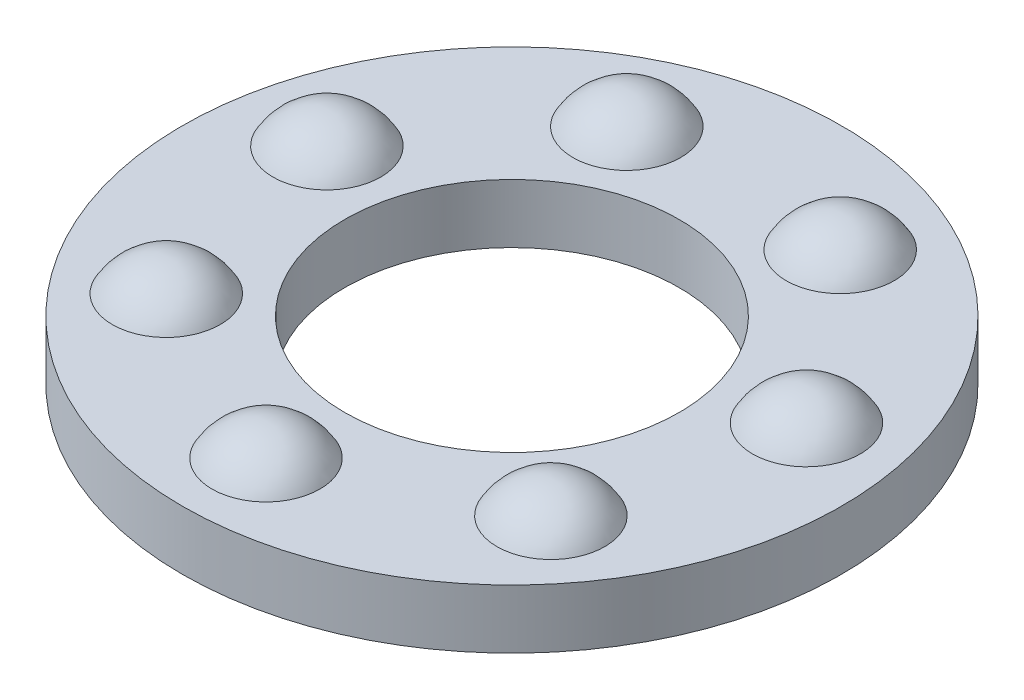
ISO-10303-21;
HEADER;
FILE_DESCRIPTION(('STEP AP214'),'2;1');
FILE_NAME('part.step','',(''),(''),'','','');
FILE_SCHEMA(('AUTOMOTIVE_DESIGN { 1 0 10303 214 1 1 1 1 }'));
ENDSEC;
DATA;
#1=APPLICATION_CONTEXT('core data for automotive mechanical design processes');
#2=APPLICATION_PROTOCOL_DEFINITION('international standard','automotive_design',2000,#1);
#3=PRODUCT_CONTEXT('',#1,'mechanical');
#4=PRODUCT('Part','Part','',(#3));
#5=PRODUCT_RELATED_PRODUCT_CATEGORY('part','',(#4));
#6=PRODUCT_DEFINITION_FORMATION('','',#4);
#7=PRODUCT_DEFINITION_CONTEXT('part definition',#1,'design');
#8=PRODUCT_DEFINITION('design','',#6,#7);
#9=PRODUCT_DEFINITION_SHAPE('','',#8);
#10=(LENGTH_UNIT() NAMED_UNIT(*) SI_UNIT(.MILLI.,.METRE.));
#11=(NAMED_UNIT(*) PLANE_ANGLE_UNIT() SI_UNIT($,.RADIAN.));
#12=(NAMED_UNIT(*) SI_UNIT($,.STERADIAN.) SOLID_ANGLE_UNIT());
#13=UNCERTAINTY_MEASURE_WITH_UNIT(LENGTH_MEASURE(1.E-05),#10,'distance_accuracy_value','');
#14=(GEOMETRIC_REPRESENTATION_CONTEXT(3) GLOBAL_UNCERTAINTY_ASSIGNED_CONTEXT((#13)) GLOBAL_UNIT_ASSIGNED_CONTEXT((#10,
#11,#12)) REPRESENTATION_CONTEXT('',''));
#15=CARTESIAN_POINT('',(0.,0.,0.));
#16=DIRECTION('',(0.,0.,1.));
#17=DIRECTION('',(1.,0.,0.));
#18=AXIS2_PLACEMENT_3D('',#15,#16,#17);
#19=CARTESIAN_POINT('',(0.,0.,2.5));
#20=DIRECTION('',(0.,1.,0.));
#21=DIRECTION('',(0.,0.,-1.));
#22=AXIS2_PLACEMENT_3D('',#19,#20,#21);
#23=SPHERICAL_SURFACE('',#22,0.625000000000001);
#24=CARTESIAN_POINT('',(0.,0.3,2.5));
#25=DIRECTION('',(0.,1.,0.));
#26=DIRECTION('',(0.,0.,1.));
#27=AXIS2_PLACEMENT_3D('',#24,#25,#26);
#28=CIRCLE('',#27,0.548292804986533);
#29=CARTESIAN_POINT('',(0.,0.3,3.04829280498653));
#30=VERTEX_POINT('',#29);
#31=EDGE_CURVE('E72',#30,#30,#28,.F.);
#32=ORIENTED_EDGE('',*,*,#31,.F.);
#33=EDGE_LOOP('',(#32));
#34=FACE_BOUND('',#33,.T.);
#35=ADVANCED_FACE('F39',(#34),#23,.T.);
#36=CARTESIAN_POINT('',(0.,0.3,0.));
#37=DIRECTION('',(0.,1.,0.));
#38=DIRECTION('',(0.,0.,1.));
#39=AXIS2_PLACEMENT_3D('',#36,#37,#38);
#40=PLANE('',#39);
#41=CARTESIAN_POINT('',(1.95457870617006,0.3,1.55872450464686));
#42=DIRECTION('',(0.,1.,0.));
#43=DIRECTION('',(0.,0.,1.));
#44=AXIS2_PLACEMENT_3D('',#41,#42,#43);
#45=CIRCLE('',#44,0.548292804986533);
#46=CARTESIAN_POINT('',(1.95457870617006,0.3,2.10701730963339));
#47=VERTEX_POINT('',#46);
#48=EDGE_CURVE('E10',#47,#47,#45,.T.);
#49=ORIENTED_EDGE('',*,*,#48,.F.);
#50=EDGE_LOOP('',(#49));
#51=FACE_BOUND('',#50,.T.);
#52=CARTESIAN_POINT('',(2.43731978045456,0.3,-0.556302334890763));
#53=DIRECTION('',(0.,1.,0.));
#54=DIRECTION('',(0.,0.,1.));
#55=AXIS2_PLACEMENT_3D('',#52,#53,#54);
#56=CIRCLE('',#55,0.548292804986533);
#57=CARTESIAN_POINT('',(2.43731978045456,0.3,-0.00800952990422923));
#58=VERTEX_POINT('',#57);
#59=EDGE_CURVE('E47',#58,#58,#56,.T.);
#60=ORIENTED_EDGE('',*,*,#59,.F.);
#61=EDGE_LOOP('',(#60));
#62=FACE_BOUND('',#61,.T.);
#63=CARTESIAN_POINT('',(1.08470934779391,0.3,-2.25242216975604));
#64=DIRECTION('',(0.,1.,0.));
#65=DIRECTION('',(0.,0.,1.));
#66=AXIS2_PLACEMENT_3D('',#63,#64,#65);
#67=CIRCLE('',#66,0.548292804986533);
#68=CARTESIAN_POINT('',(1.08470934779391,0.3,-1.70412936476951));
#69=VERTEX_POINT('',#68);
#70=EDGE_CURVE('E54',#69,#69,#67,.T.);
#71=ORIENTED_EDGE('',*,*,#70,.F.);
#72=EDGE_LOOP('',(#71));
#73=FACE_BOUND('',#72,.T.);
#74=CARTESIAN_POINT('',(-1.08470934779388,0.3,-2.25242216975605));
#75=DIRECTION('',(0.,1.,0.));
#76=DIRECTION('',(0.,0.,1.));
#77=AXIS2_PLACEMENT_3D('',#74,#75,#76);
#78=CIRCLE('',#77,0.548292804986533);
#79=CARTESIAN_POINT('',(-1.08470934779388,0.3,-1.70412936476952));
#80=VERTEX_POINT('',#79);
#81=EDGE_CURVE('E60',#80,#80,#78,.T.);
#82=ORIENTED_EDGE('',*,*,#81,.F.);
#83=EDGE_LOOP('',(#82));
#84=FACE_BOUND('',#83,.T.);
#85=CARTESIAN_POINT('',(-2.43731978045456,0.3,-0.556302334890796));
#86=DIRECTION('',(0.,1.,0.));
#87=DIRECTION('',(0.,0.,1.));
#88=AXIS2_PLACEMENT_3D('',#85,#86,#87);
#89=CIRCLE('',#88,0.548292804986533);
#90=CARTESIAN_POINT('',(-2.43731978045456,0.3,-0.00800952990426219));
#91=VERTEX_POINT('',#90);
#92=EDGE_CURVE('E64',#91,#91,#89,.T.);
#93=ORIENTED_EDGE('',*,*,#92,.F.);
#94=EDGE_LOOP('',(#93));
#95=FACE_BOUND('',#94,.T.);
#96=CARTESIAN_POINT('',(-1.95457870617008,0.3,1.55872450464683));
#97=DIRECTION('',(0.,1.,0.));
#98=DIRECTION('',(0.,0.,1.));
#99=AXIS2_PLACEMENT_3D('',#96,#97,#98);
#100=CIRCLE('',#99,0.548292804986533);
#101=CARTESIAN_POINT('',(-1.95457870617008,0.3,2.10701730963336));
#102=VERTEX_POINT('',#101);
#103=EDGE_CURVE('E68',#102,#102,#100,.T.);
#104=ORIENTED_EDGE('',*,*,#103,.F.);
#105=EDGE_LOOP('',(#104));
#106=FACE_BOUND('',#105,.T.);
#107=ORIENTED_EDGE('',*,*,#31,.T.);
#108=EDGE_LOOP('',(#107));
#109=FACE_BOUND('',#108,.T.);
#110=CARTESIAN_POINT('',(0.,0.3,0.));
#111=DIRECTION('',(0.,1.,0.));
#112=DIRECTION('',(0.,0.,1.));
#113=AXIS2_PLACEMENT_3D('',#110,#111,#112);
#114=CIRCLE('',#113,3.35);
#115=CARTESIAN_POINT('',(0.,0.3,3.35));
#116=VERTEX_POINT('',#115);
#117=EDGE_CURVE('E83',#116,#116,#114,.T.);
#118=ORIENTED_EDGE('',*,*,#117,.T.);
#119=EDGE_LOOP('',(#118));
#120=FACE_BOUND('',#119,.T.);
#121=CARTESIAN_POINT('',(0.,0.3,0.));
#122=DIRECTION('',(0.,1.,0.));
#123=DIRECTION('',(0.,0.,1.));
#124=AXIS2_PLACEMENT_3D('',#121,#122,#123);
#125=CIRCLE('',#124,1.7);
#126=CARTESIAN_POINT('',(0.,0.3,1.7));
#127=VERTEX_POINT('',#126);
#128=EDGE_CURVE('E73',#127,#127,#125,.T.);
#129=ORIENTED_EDGE('',*,*,#128,.F.);
#130=EDGE_LOOP('',(#129));
#131=FACE_BOUND('',#130,.T.);
#132=ADVANCED_FACE('F134',(#51,#62,#73,#84,#95,#106,#109,#120,#131),#40,.T.);
#133=CARTESIAN_POINT('',(0.,-0.3,0.));
#134=DIRECTION('',(0.,1.,0.));
#135=DIRECTION('',(0.,0.,1.));
#136=AXIS2_PLACEMENT_3D('',#133,#134,#135);
#137=PLANE('',#136);
#138=CARTESIAN_POINT('',(1.95457870617006,-0.3,1.55872450464686));
#139=DIRECTION('',(0.,1.,0.));
#140=DIRECTION('',(0.,0.,1.));
#141=AXIS2_PLACEMENT_3D('',#138,#139,#140);
#142=CIRCLE('',#141,0.548292804986533);
#143=CARTESIAN_POINT('',(1.95457870617006,-0.3,2.10701730963339));
#144=VERTEX_POINT('',#143);
#145=EDGE_CURVE('E42',#144,#144,#142,.T.);
#146=ORIENTED_EDGE('',*,*,#145,.T.);
#147=EDGE_LOOP('',(#146));
#148=FACE_BOUND('',#147,.T.);
#149=CARTESIAN_POINT('',(2.43731978045456,-0.3,-0.556302334890763));
#150=DIRECTION('',(0.,1.,0.));
#151=DIRECTION('',(0.,0.,1.));
#152=AXIS2_PLACEMENT_3D('',#149,#150,#151);
#153=CIRCLE('',#152,0.548292804986533);
#154=CARTESIAN_POINT('',(2.43731978045456,-0.3,-0.00800952990422923));
#155=VERTEX_POINT('',#154);
#156=EDGE_CURVE('E111',#155,#155,#153,.T.);
#157=ORIENTED_EDGE('',*,*,#156,.T.);
#158=EDGE_LOOP('',(#157));
#159=FACE_BOUND('',#158,.T.);
#160=CARTESIAN_POINT('',(1.08470934779391,-0.3,-2.25242216975604));
#161=DIRECTION('',(0.,1.,0.));
#162=DIRECTION('',(0.,0.,1.));
#163=AXIS2_PLACEMENT_3D('',#160,#161,#162);
#164=CIRCLE('',#163,0.548292804986533);
#165=CARTESIAN_POINT('',(1.08470934779391,-0.3,-1.70412936476951));
#166=VERTEX_POINT('',#165);
#167=EDGE_CURVE('E108',#166,#166,#164,.T.);
#168=ORIENTED_EDGE('',*,*,#167,.T.);
#169=EDGE_LOOP('',(#168));
#170=FACE_BOUND('',#169,.T.);
#171=CARTESIAN_POINT('',(-1.08470934779388,-0.3,-2.25242216975605));
#172=DIRECTION('',(0.,1.,0.));
#173=DIRECTION('',(0.,0.,1.));
#174=AXIS2_PLACEMENT_3D('',#171,#172,#173);
#175=CIRCLE('',#174,0.548292804986533);
#176=CARTESIAN_POINT('',(-1.08470934779388,-0.3,-1.70412936476952));
#177=VERTEX_POINT('',#176);
#178=EDGE_CURVE('E104',#177,#177,#175,.T.);
#179=ORIENTED_EDGE('',*,*,#178,.T.);
#180=EDGE_LOOP('',(#179));
#181=FACE_BOUND('',#180,.T.);
#182=CARTESIAN_POINT('',(-2.43731978045456,-0.3,-0.556302334890796));
#183=DIRECTION('',(0.,1.,0.));
#184=DIRECTION('',(0.,0.,1.));
#185=AXIS2_PLACEMENT_3D('',#182,#183,#184);
#186=CIRCLE('',#185,0.548292804986533);
#187=CARTESIAN_POINT('',(-2.43731978045456,-0.3,-0.00800952990426219));
#188=VERTEX_POINT('',#187);
#189=EDGE_CURVE('E100',#188,#188,#186,.T.);
#190=ORIENTED_EDGE('',*,*,#189,.T.);
#191=EDGE_LOOP('',(#190));
#192=FACE_BOUND('',#191,.T.);
#193=CARTESIAN_POINT('',(-1.95457870617008,-0.3,1.55872450464683));
#194=DIRECTION('',(0.,1.,0.));
#195=DIRECTION('',(0.,0.,1.));
#196=AXIS2_PLACEMENT_3D('',#193,#194,#195);
#197=CIRCLE('',#196,0.548292804986533);
#198=CARTESIAN_POINT('',(-1.95457870617008,-0.3,2.10701730963336));
#199=VERTEX_POINT('',#198);
#200=EDGE_CURVE('E82',#199,#199,#197,.T.);
#201=ORIENTED_EDGE('',*,*,#200,.T.);
#202=EDGE_LOOP('',(#201));
#203=FACE_BOUND('',#202,.T.);
#204=CARTESIAN_POINT('',(0.,-0.3,2.5));
#205=DIRECTION('',(0.,1.,0.));
#206=DIRECTION('',(0.,0.,1.));
#207=AXIS2_PLACEMENT_3D('',#204,#205,#206);
#208=CIRCLE('',#207,0.548292804986533);
#209=CARTESIAN_POINT('',(0.,-0.3,3.04829280498653));
#210=VERTEX_POINT('',#209);
#211=EDGE_CURVE('E87',#210,#210,#208,.F.);
#212=ORIENTED_EDGE('',*,*,#211,.F.);
#213=EDGE_LOOP('',(#212));
#214=FACE_BOUND('',#213,.T.);
#215=CARTESIAN_POINT('',(0.,-0.3,0.));
#216=DIRECTION('',(0.,1.,0.));
#217=DIRECTION('',(0.,0.,1.));
#218=AXIS2_PLACEMENT_3D('',#215,#216,#217);
#219=CIRCLE('',#218,3.35);
#220=CARTESIAN_POINT('',(0.,-0.3,3.35));
#221=VERTEX_POINT('',#220);
#222=EDGE_CURVE('E77',#221,#221,#219,.T.);
#223=ORIENTED_EDGE('',*,*,#222,.F.);
#224=EDGE_LOOP('',(#223));
#225=FACE_BOUND('',#224,.T.);
#226=CARTESIAN_POINT('',(0.,-0.3,0.));
#227=DIRECTION('',(0.,1.,0.));
#228=DIRECTION('',(0.,0.,1.));
#229=AXIS2_PLACEMENT_3D('',#226,#227,#228);
#230=CIRCLE('',#229,1.7);
#231=CARTESIAN_POINT('',(0.,-0.3,1.7));
#232=VERTEX_POINT('',#231);
#233=EDGE_CURVE('E78',#232,#232,#230,.T.);
#234=ORIENTED_EDGE('',*,*,#233,.T.);
#235=EDGE_LOOP('',(#234));
#236=FACE_BOUND('',#235,.T.);
#237=ADVANCED_FACE('F119',(#148,#159,#170,#181,#192,#203,#214,#225,#236),#137,.F.);
#238=CARTESIAN_POINT('',(0.,0.3,0.));
#239=DIRECTION('',(0.,-1.,0.));
#240=DIRECTION('',(0.,0.,-1.));
#241=AXIS2_PLACEMENT_3D('',#238,#239,#240);
#242=CYLINDRICAL_SURFACE('',#241,3.35);
#243=ORIENTED_EDGE('',*,*,#117,.F.);
#244=EDGE_LOOP('',(#243));
#245=FACE_BOUND('',#244,.T.);
#246=ORIENTED_EDGE('',*,*,#222,.T.);
#247=EDGE_LOOP('',(#246));
#248=FACE_BOUND('',#247,.T.);
#249=ADVANCED_FACE('F154',(#245,#248),#242,.T.);
#250=CARTESIAN_POINT('',(0.,0.3,0.));
#251=DIRECTION('',(0.,-1.,0.));
#252=DIRECTION('',(0.,0.,-1.));
#253=AXIS2_PLACEMENT_3D('',#250,#251,#252);
#254=CYLINDRICAL_SURFACE('',#253,1.7);
#255=ORIENTED_EDGE('',*,*,#128,.T.);
#256=EDGE_LOOP('',(#255));
#257=FACE_BOUND('',#256,.T.);
#258=ORIENTED_EDGE('',*,*,#233,.F.);
#259=EDGE_LOOP('',(#258));
#260=FACE_BOUND('',#259,.T.);
#261=ADVANCED_FACE('F145',(#257,#260),#254,.F.);
#262=ORIENTED_EDGE('',*,*,#211,.T.);
#263=EDGE_LOOP('',(#262));
#264=FACE_BOUND('',#263,.T.);
#265=ADVANCED_FACE('F136',(#264),#23,.T.);
#266=CARTESIAN_POINT('',(-1.95457870617008,0.,1.55872450464683));
#267=DIRECTION('',(0.,1.,0.));
#268=DIRECTION('',(0.781831482468031,0.,-0.623489801858732));
#269=AXIS2_PLACEMENT_3D('',#266,#267,#268);
#270=SPHERICAL_SURFACE('',#269,0.625000000000001);
#271=ORIENTED_EDGE('',*,*,#200,.F.);
#272=EDGE_LOOP('',(#271));
#273=FACE_BOUND('',#272,.T.);
#274=ADVANCED_FACE('F144',(#273),#270,.T.);
#275=ORIENTED_EDGE('',*,*,#103,.T.);
#276=EDGE_LOOP('',(#275));
#277=FACE_BOUND('',#276,.T.);
#278=ADVANCED_FACE('F151',(#277),#270,.T.);
#279=CARTESIAN_POINT('',(-2.43731978045456,0.,-0.556302334890796));
#280=DIRECTION('',(0.,1.,0.));
#281=DIRECTION('',(0.974927912181823,0.,0.222520933956318));
#282=AXIS2_PLACEMENT_3D('',#279,#280,#281);
#283=SPHERICAL_SURFACE('',#282,0.625000000000001);
#284=ORIENTED_EDGE('',*,*,#189,.F.);
#285=EDGE_LOOP('',(#284));
#286=FACE_BOUND('',#285,.T.);
#287=ADVANCED_FACE('F174',(#286),#283,.T.);
#288=ORIENTED_EDGE('',*,*,#92,.T.);
#289=EDGE_LOOP('',(#288));
#290=FACE_BOUND('',#289,.T.);
#291=ADVANCED_FACE('F176',(#290),#283,.T.);
#292=CARTESIAN_POINT('',(-1.08470934779388,0.,-2.25242216975605));
#293=DIRECTION('',(0.,1.,0.));
#294=DIRECTION('',(0.433883739117553,0.,0.900968867902422));
#295=AXIS2_PLACEMENT_3D('',#292,#293,#294);
#296=SPHERICAL_SURFACE('',#295,0.625000000000001);
#297=ORIENTED_EDGE('',*,*,#178,.F.);
#298=EDGE_LOOP('',(#297));
#299=FACE_BOUND('',#298,.T.);
#300=ADVANCED_FACE('F179',(#299),#296,.T.);
#301=ORIENTED_EDGE('',*,*,#81,.T.);
#302=EDGE_LOOP('',(#301));
#303=FACE_BOUND('',#302,.T.);
#304=ADVANCED_FACE('F181',(#303),#296,.T.);
#305=CARTESIAN_POINT('',(1.08470934779391,0.,-2.25242216975604));
#306=DIRECTION('',(0.,1.,0.));
#307=DIRECTION('',(-0.433883739117565,0.,0.900968867902416));
#308=AXIS2_PLACEMENT_3D('',#305,#306,#307);
#309=SPHERICAL_SURFACE('',#308,0.625000000000001);
#310=ORIENTED_EDGE('',*,*,#167,.F.);
#311=EDGE_LOOP('',(#310));
#312=FACE_BOUND('',#311,.T.);
#313=ADVANCED_FACE('F184',(#312),#309,.T.);
#314=ORIENTED_EDGE('',*,*,#70,.T.);
#315=EDGE_LOOP('',(#314));
#316=FACE_BOUND('',#315,.T.);
#317=ADVANCED_FACE('F186',(#316),#309,.T.);
#318=CARTESIAN_POINT('',(2.43731978045456,0.,-0.556302334890763));
#319=DIRECTION('',(0.,1.,0.));
#320=DIRECTION('',(-0.974927912181826,0.,0.222520933956305));
#321=AXIS2_PLACEMENT_3D('',#318,#319,#320);
#322=SPHERICAL_SURFACE('',#321,0.625000000000001);
#323=ORIENTED_EDGE('',*,*,#156,.F.);
#324=EDGE_LOOP('',(#323));
#325=FACE_BOUND('',#324,.T.);
#326=ADVANCED_FACE('F130',(#325),#322,.T.);
#327=ORIENTED_EDGE('',*,*,#59,.T.);
#328=EDGE_LOOP('',(#327));
#329=FACE_BOUND('',#328,.T.);
#330=ADVANCED_FACE('F124',(#329),#322,.T.);
#331=CARTESIAN_POINT('',(1.95457870617006,0.,1.55872450464686));
#332=DIRECTION('',(0.,1.,0.));
#333=DIRECTION('',(-0.781831482468022,0.,-0.623489801858743));
#334=AXIS2_PLACEMENT_3D('',#331,#332,#333);
#335=SPHERICAL_SURFACE('',#334,0.625000000000001);
#336=ORIENTED_EDGE('',*,*,#145,.F.);
#337=EDGE_LOOP('',(#336));
#338=FACE_BOUND('',#337,.T.);
#339=ADVANCED_FACE('F121',(#338),#335,.T.);
#340=ORIENTED_EDGE('',*,*,#48,.T.);
#341=EDGE_LOOP('',(#340));
#342=FACE_BOUND('',#341,.T.);
#343=ADVANCED_FACE('F123',(#342),#335,.T.);
#344=CLOSED_SHELL('',(#35,#132,#237,#249,#261,#265,#274,#278,#287,#291,#300,#304,#313,#317,#326,
#330,#339,#343));
#345=MANIFOLD_SOLID_BREP('B2',#344);
#346=ADVANCED_BREP_SHAPE_REPRESENTATION('',(#18,#345),#14);
#347=SHAPE_DEFINITION_REPRESENTATION(#9,#346);
ENDSEC;
END-ISO-10303-21;
